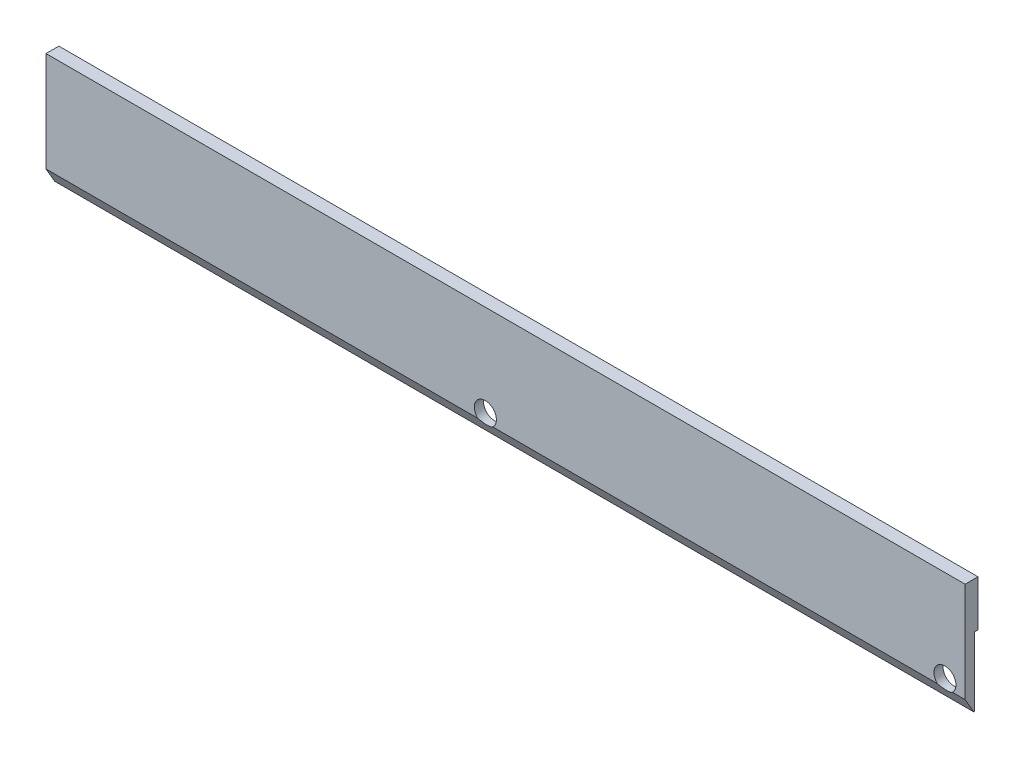
ISO-10303-21;
HEADER;
FILE_DESCRIPTION(('STEP AP214'),'2;1');
FILE_NAME('part.step','',(''),(''),'','','');
FILE_SCHEMA(('AUTOMOTIVE_DESIGN { 1 0 10303 214 1 1 1 1 }'));
ENDSEC;
DATA;
#1=APPLICATION_CONTEXT('core data for automotive mechanical design processes');
#2=APPLICATION_PROTOCOL_DEFINITION('international standard','automotive_design',2000,#1);
#3=PRODUCT_CONTEXT('',#1,'mechanical');
#4=PRODUCT('Part','Part','',(#3));
#5=PRODUCT_RELATED_PRODUCT_CATEGORY('part','',(#4));
#6=PRODUCT_DEFINITION_FORMATION('','',#4);
#7=PRODUCT_DEFINITION_CONTEXT('part definition',#1,'design');
#8=PRODUCT_DEFINITION('design','',#6,#7);
#9=PRODUCT_DEFINITION_SHAPE('','',#8);
#10=(LENGTH_UNIT() NAMED_UNIT(*) SI_UNIT(.MILLI.,.METRE.));
#11=(NAMED_UNIT(*) PLANE_ANGLE_UNIT() SI_UNIT($,.RADIAN.));
#12=(NAMED_UNIT(*) SI_UNIT($,.STERADIAN.) SOLID_ANGLE_UNIT());
#13=UNCERTAINTY_MEASURE_WITH_UNIT(LENGTH_MEASURE(1.E-05),#10,'distance_accuracy_value','');
#14=(GEOMETRIC_REPRESENTATION_CONTEXT(3) GLOBAL_UNCERTAINTY_ASSIGNED_CONTEXT((#13)) GLOBAL_UNIT_ASSIGNED_CONTEXT((#10,
#11,#12)) REPRESENTATION_CONTEXT('',''));
#15=CARTESIAN_POINT('',(0.,0.,0.));
#16=DIRECTION('',(0.,0.,1.));
#17=DIRECTION('',(1.,0.,0.));
#18=AXIS2_PLACEMENT_3D('',#15,#16,#17);
#19=CARTESIAN_POINT('',(0.,0.,0.));
#20=DIRECTION('',(0.,0.,1.));
#21=DIRECTION('',(1.,0.,0.));
#22=AXIS2_PLACEMENT_3D('',#19,#20,#21);
#23=PLANE('',#22);
#24=CARTESIAN_POINT('',(248.412,12.7,0.));
#25=DIRECTION('',(0.,0.,1.));
#26=DIRECTION('',(1.,0.,0.));
#27=AXIS2_PLACEMENT_3D('',#24,#25,#26);
#28=CIRCLE('',#27,3.04800000000001);
#29=CARTESIAN_POINT('',(251.46,12.7,0.));
#30=VERTEX_POINT('',#29);
#31=EDGE_CURVE('E148',#30,#30,#28,.T.);
#32=ORIENTED_EDGE('',*,*,#31,.T.);
#33=EDGE_LOOP('',(#32));
#34=FACE_BOUND('',#33,.T.);
#35=CARTESIAN_POINT('',(121.412,12.7,0.));
#36=DIRECTION('',(0.,0.,1.));
#37=DIRECTION('',(1.,0.,0.));
#38=AXIS2_PLACEMENT_3D('',#35,#36,#37);
#39=CIRCLE('',#38,3.048);
#40=CARTESIAN_POINT('',(124.46,12.7,0.));
#41=VERTEX_POINT('',#40);
#42=EDGE_CURVE('E167',#41,#41,#39,.T.);
#43=ORIENTED_EDGE('',*,*,#42,.T.);
#44=EDGE_LOOP('',(#43));
#45=FACE_BOUND('',#44,.T.);
#46=DIRECTION('',(-0.488603368931844,-0.87250601594972,0.));
#47=VECTOR('',#46,1.);
#48=CARTESIAN_POINT('',(3.556,6.35,0.));
#49=LINE('',#48,#47);
#50=CARTESIAN_POINT('',(14.224,25.4,0.));
#51=VERTEX_POINT('',#50);
#52=CARTESIAN_POINT('',(3.556,6.35,0.));
#53=VERTEX_POINT('',#52);
#54=EDGE_CURVE('E124',#51,#53,#49,.T.);
#55=ORIENTED_EDGE('',*,*,#54,.F.);
#56=DIRECTION('',(-1.,0.,0.));
#57=VECTOR('',#56,1.);
#58=CARTESIAN_POINT('',(254.,25.4,0.));
#59=LINE('',#58,#57);
#60=CARTESIAN_POINT('',(254.,25.4,0.));
#61=VERTEX_POINT('',#60);
#62=EDGE_CURVE('E51',#61,#51,#59,.T.);
#63=ORIENTED_EDGE('',*,*,#62,.F.);
#64=DIRECTION('',(0.,-1.,0.));
#65=VECTOR('',#64,1.);
#66=CARTESIAN_POINT('',(254.,0.,0.));
#67=LINE('',#66,#65);
#68=CARTESIAN_POINT('',(254.,6.35,0.));
#69=VERTEX_POINT('',#68);
#70=EDGE_CURVE('E170',#61,#69,#67,.T.);
#71=ORIENTED_EDGE('',*,*,#70,.T.);
#72=DIRECTION('',(1.,0.,0.));
#73=VECTOR('',#72,1.);
#74=CARTESIAN_POINT('',(0.,6.35,0.));
#75=LINE('',#74,#73);
#76=EDGE_CURVE('E153',#53,#69,#75,.T.);
#77=ORIENTED_EDGE('',*,*,#76,.F.);
#78=EDGE_LOOP('',(#55,#63,#71,#77));
#79=FACE_BOUND('',#78,.T.);
#80=ADVANCED_FACE('F36',(#34,#45,#79),#23,.F.);
#81=CARTESIAN_POINT('',(254.,25.4,-1.016));
#82=DIRECTION('',(0.,1.,0.));
#83=DIRECTION('',(-1.,0.,0.));
#84=AXIS2_PLACEMENT_3D('',#81,#82,#83);
#85=PLANE('',#84);
#86=DIRECTION('',(0.,0.,1.));
#87=VECTOR('',#86,1.);
#88=CARTESIAN_POINT('',(14.224,25.4,-1.016));
#89=LINE('',#88,#87);
#90=CARTESIAN_POINT('',(14.224,25.4,-1.016));
#91=VERTEX_POINT('',#90);
#92=EDGE_CURVE('E116',#91,#51,#89,.T.);
#93=ORIENTED_EDGE('',*,*,#92,.F.);
#94=DIRECTION('',(-1.,0.,0.));
#95=VECTOR('',#94,1.);
#96=CARTESIAN_POINT('',(254.,25.4,-1.016));
#97=LINE('',#96,#95);
#98=CARTESIAN_POINT('',(254.,25.4,-1.016));
#99=VERTEX_POINT('',#98);
#100=EDGE_CURVE('E129',#99,#91,#97,.T.);
#101=ORIENTED_EDGE('',*,*,#100,.F.);
#102=DIRECTION('',(0.,0.,1.));
#103=VECTOR('',#102,1.);
#104=CARTESIAN_POINT('',(254.,25.4,-1.016));
#105=LINE('',#104,#103);
#106=EDGE_CURVE('E145',#99,#61,#105,.T.);
#107=ORIENTED_EDGE('',*,*,#106,.T.);
#108=ORIENTED_EDGE('',*,*,#62,.T.);
#109=EDGE_LOOP('',(#93,#101,#107,#108));
#110=FACE_BOUND('',#109,.T.);
#111=ADVANCED_FACE('F127',(#110),#85,.F.);
#112=CARTESIAN_POINT('',(254.,0.,2.54));
#113=DIRECTION('',(1.,0.,0.));
#114=DIRECTION('',(0.,0.,-1.));
#115=AXIS2_PLACEMENT_3D('',#112,#113,#114);
#116=PLANE('',#115);
#117=DIRECTION('',(0.,-1.,0.));
#118=VECTOR('',#117,1.);
#119=CARTESIAN_POINT('',(254.,0.,2.54));
#120=LINE('',#119,#118);
#121=CARTESIAN_POINT('',(254.,38.1,2.54));
#122=VERTEX_POINT('',#121);
#123=CARTESIAN_POINT('',(254.,10.4722809220139,2.54));
#124=VERTEX_POINT('',#123);
#125=EDGE_CURVE('E156',#122,#124,#120,.T.);
#126=ORIENTED_EDGE('',*,*,#125,.T.);
#127=DIRECTION('',(0.,-0.866025403784436,-0.500000000000005));
#128=VECTOR('',#127,1.);
#129=CARTESIAN_POINT('',(254.,2.61807023050352,-1.99463065701559));
#130=LINE('',#129,#128);
#131=CARTESIAN_POINT('',(254.,6.35,0.160000000000007));
#132=VERTEX_POINT('',#131);
#133=EDGE_CURVE('E192',#124,#132,#130,.T.);
#134=ORIENTED_EDGE('',*,*,#133,.T.);
#135=DIRECTION('',(0.,0.,-1.));
#136=VECTOR('',#135,1.);
#137=CARTESIAN_POINT('',(254.,6.35,2.54));
#138=LINE('',#137,#136);
#139=EDGE_CURVE('E164',#132,#69,#138,.T.);
#140=ORIENTED_EDGE('',*,*,#139,.T.);
#141=ORIENTED_EDGE('',*,*,#70,.F.);
#142=ORIENTED_EDGE('',*,*,#106,.F.);
#143=DIRECTION('',(0.,-1.,0.));
#144=VECTOR('',#143,1.);
#145=CARTESIAN_POINT('',(254.,38.1,-1.016));
#146=LINE('',#145,#144);
#147=CARTESIAN_POINT('',(254.,38.1,-1.016));
#148=VERTEX_POINT('',#147);
#149=EDGE_CURVE('E135',#148,#99,#146,.T.);
#150=ORIENTED_EDGE('',*,*,#149,.F.);
#151=DIRECTION('',(0.,0.,-1.));
#152=VECTOR('',#151,1.);
#153=CARTESIAN_POINT('',(254.,38.1,2.54));
#154=LINE('',#153,#152);
#155=EDGE_CURVE('E179',#122,#148,#154,.T.);
#156=ORIENTED_EDGE('',*,*,#155,.F.);
#157=EDGE_LOOP('',(#126,#134,#140,#141,#142,#150,#156));
#158=FACE_BOUND('',#157,.T.);
#159=ADVANCED_FACE('F195',(#158),#116,.T.);
#160=CARTESIAN_POINT('',(0.,38.1,2.54));
#161=DIRECTION('',(0.,1.,0.));
#162=DIRECTION('',(0.,0.,1.));
#163=AXIS2_PLACEMENT_3D('',#160,#161,#162);
#164=PLANE('',#163);
#165=ORIENTED_EDGE('',*,*,#155,.T.);
#166=DIRECTION('',(1.,0.,0.));
#167=VECTOR('',#166,1.);
#168=CARTESIAN_POINT('',(254.,38.1,-1.016));
#169=LINE('',#168,#167);
#170=CARTESIAN_POINT('',(0.,38.1,-1.016));
#171=VERTEX_POINT('',#170);
#172=EDGE_CURVE('E140',#171,#148,#169,.T.);
#173=ORIENTED_EDGE('',*,*,#172,.F.);
#174=DIRECTION('',(0.,0.,-1.));
#175=VECTOR('',#174,1.);
#176=CARTESIAN_POINT('',(0.,38.1,2.54));
#177=LINE('',#176,#175);
#178=CARTESIAN_POINT('',(0.,38.1,2.54));
#179=VERTEX_POINT('',#178);
#180=EDGE_CURVE('E177',#179,#171,#177,.T.);
#181=ORIENTED_EDGE('',*,*,#180,.F.);
#182=DIRECTION('',(1.,0.,0.));
#183=VECTOR('',#182,1.);
#184=CARTESIAN_POINT('',(0.,38.1,2.54));
#185=LINE('',#184,#183);
#186=EDGE_CURVE('E159',#179,#122,#185,.T.);
#187=ORIENTED_EDGE('',*,*,#186,.T.);
#188=EDGE_LOOP('',(#165,#173,#181,#187));
#189=FACE_BOUND('',#188,.T.);
#190=ADVANCED_FACE('F213',(#189),#164,.T.);
#191=CARTESIAN_POINT('',(0.,0.,2.54));
#192=DIRECTION('',(-1.,0.,0.));
#193=DIRECTION('',(0.,0.,1.));
#194=AXIS2_PLACEMENT_3D('',#191,#192,#193);
#195=PLANE('',#194);
#196=DIRECTION('',(0.,0.,-1.));
#197=VECTOR('',#196,1.);
#198=CARTESIAN_POINT('',(0.,6.35,2.54));
#199=LINE('',#198,#197);
#200=CARTESIAN_POINT('',(0.,6.35,0.160000000000007));
#201=VERTEX_POINT('',#200);
#202=CARTESIAN_POINT('',(0.,6.35,-1.016));
#203=VERTEX_POINT('',#202);
#204=EDGE_CURVE('E175',#201,#203,#199,.T.);
#205=ORIENTED_EDGE('',*,*,#204,.F.);
#206=DIRECTION('',(0.,0.866025403784436,0.500000000000005));
#207=VECTOR('',#206,1.);
#208=CARTESIAN_POINT('',(0.,2.61807023050352,-1.99463065701559));
#209=LINE('',#208,#207);
#210=CARTESIAN_POINT('',(0.,10.4722809220139,2.54));
#211=VERTEX_POINT('',#210);
#212=EDGE_CURVE('E11',#201,#211,#209,.T.);
#213=ORIENTED_EDGE('',*,*,#212,.T.);
#214=DIRECTION('',(0.,1.,0.));
#215=VECTOR('',#214,1.);
#216=CARTESIAN_POINT('',(0.,0.,2.54));
#217=LINE('',#216,#215);
#218=EDGE_CURVE('E162',#211,#179,#217,.T.);
#219=ORIENTED_EDGE('',*,*,#218,.T.);
#220=ORIENTED_EDGE('',*,*,#180,.T.);
#221=DIRECTION('',(0.,1.,0.));
#222=VECTOR('',#221,1.);
#223=CARTESIAN_POINT('',(0.,38.1,-1.016));
#224=LINE('',#223,#222);
#225=EDGE_CURVE('E137',#203,#171,#224,.T.);
#226=ORIENTED_EDGE('',*,*,#225,.F.);
#227=EDGE_LOOP('',(#205,#213,#219,#220,#226));
#228=FACE_BOUND('',#227,.T.);
#229=ADVANCED_FACE('F205',(#228),#195,.T.);
#230=CARTESIAN_POINT('',(121.412,12.7,2.54));
#231=DIRECTION('',(0.,0.,-1.));
#232=DIRECTION('',(-1.,0.,0.));
#233=AXIS2_PLACEMENT_3D('',#230,#231,#232);
#234=CYLINDRICAL_SURFACE('',#233,3.048);
#235=CARTESIAN_POINT('',(121.412,12.7,2.54));
#236=DIRECTION('',(0.,0.,1.));
#237=DIRECTION('',(1.,0.,0.));
#238=AXIS2_PLACEMENT_3D('',#235,#236,#237);
#239=CIRCLE('',#238,3.048);
#240=CARTESIAN_POINT('',(123.492281641888,10.4722809220139,2.54));
#241=VERTEX_POINT('',#240);
#242=CARTESIAN_POINT('',(119.331718358112,10.4722809220139,2.54));
#243=VERTEX_POINT('',#242);
#244=EDGE_CURVE('E152',#241,#243,#239,.T.);
#245=ORIENTED_EDGE('',*,*,#244,.T.);
#246=CARTESIAN_POINT('',(121.412,12.7,3.82617420935418));
#247=DIRECTION('',(0.,-0.500000000000005,0.866025403784436));
#248=DIRECTION('',(0.,-0.866025403784436,-0.500000000000005));
#249=AXIS2_PLACEMENT_3D('',#246,#247,#248);
#250=ELLIPSE('',#249,3.51952724097997,3.048);
#251=EDGE_CURVE('E188',#243,#241,#250,.T.);
#252=ORIENTED_EDGE('',*,*,#251,.T.);
#253=EDGE_LOOP('',(#245,#252));
#254=FACE_BOUND('',#253,.T.);
#255=ORIENTED_EDGE('',*,*,#42,.F.);
#256=EDGE_LOOP('',(#255));
#257=FACE_BOUND('',#256,.T.);
#258=ADVANCED_FACE('F233',(#254,#257),#234,.F.);
#259=CARTESIAN_POINT('',(248.412,12.7,2.54));
#260=DIRECTION('',(0.,0.,-1.));
#261=DIRECTION('',(-1.,0.,0.));
#262=AXIS2_PLACEMENT_3D('',#259,#260,#261);
#263=CYLINDRICAL_SURFACE('',#262,3.04800000000001);
#264=CARTESIAN_POINT('',(248.412,12.7,2.54));
#265=DIRECTION('',(0.,0.,1.));
#266=DIRECTION('',(1.,0.,0.));
#267=AXIS2_PLACEMENT_3D('',#264,#265,#266);
#268=CIRCLE('',#267,3.04800000000001);
#269=CARTESIAN_POINT('',(250.492281641888,10.4722809220139,2.54));
#270=VERTEX_POINT('',#269);
#271=CARTESIAN_POINT('',(246.331718358112,10.4722809220139,2.54));
#272=VERTEX_POINT('',#271);
#273=EDGE_CURVE('E149',#270,#272,#268,.T.);
#274=ORIENTED_EDGE('',*,*,#273,.T.);
#275=CARTESIAN_POINT('',(248.412,12.7,3.82617420935418));
#276=DIRECTION('',(0.,-0.500000000000005,0.866025403784436));
#277=DIRECTION('',(0.,-0.866025403784436,-0.500000000000005));
#278=AXIS2_PLACEMENT_3D('',#275,#276,#277);
#279=ELLIPSE('',#278,3.51952724097998,3.04800000000001);
#280=EDGE_CURVE('E190',#272,#270,#279,.T.);
#281=ORIENTED_EDGE('',*,*,#280,.T.);
#282=EDGE_LOOP('',(#274,#281));
#283=FACE_BOUND('',#282,.T.);
#284=ORIENTED_EDGE('',*,*,#31,.F.);
#285=EDGE_LOOP('',(#284));
#286=FACE_BOUND('',#285,.T.);
#287=ADVANCED_FACE('F230',(#283,#286),#263,.F.);
#288=CARTESIAN_POINT('',(0.,6.35,2.54));
#289=DIRECTION('',(0.,1.,0.));
#290=DIRECTION('',(0.,0.,1.));
#291=AXIS2_PLACEMENT_3D('',#288,#289,#290);
#292=PLANE('',#291);
#293=ORIENTED_EDGE('',*,*,#139,.F.);
#294=DIRECTION('',(-1.,0.,0.));
#295=VECTOR('',#294,1.);
#296=CARTESIAN_POINT('',(0.,6.35,0.160000000000007));
#297=LINE('',#296,#295);
#298=EDGE_CURVE('E44',#132,#201,#297,.T.);
#299=ORIENTED_EDGE('',*,*,#298,.T.);
#300=ORIENTED_EDGE('',*,*,#204,.T.);
#301=DIRECTION('',(-1.,0.,0.));
#302=VECTOR('',#301,1.);
#303=CARTESIAN_POINT('',(0.,6.35,-1.016));
#304=LINE('',#303,#302);
#305=CARTESIAN_POINT('',(3.556,6.35,-1.016));
#306=VERTEX_POINT('',#305);
#307=EDGE_CURVE('E123',#306,#203,#304,.T.);
#308=ORIENTED_EDGE('',*,*,#307,.F.);
#309=DIRECTION('',(0.,0.,1.));
#310=VECTOR('',#309,1.);
#311=CARTESIAN_POINT('',(3.556,6.35,-1.016));
#312=LINE('',#311,#310);
#313=EDGE_CURVE('E118',#306,#53,#312,.T.);
#314=ORIENTED_EDGE('',*,*,#313,.T.);
#315=ORIENTED_EDGE('',*,*,#76,.T.);
#316=EDGE_LOOP('',(#293,#299,#300,#308,#314,#315));
#317=FACE_BOUND('',#316,.T.);
#318=ADVANCED_FACE('F199',(#317),#292,.F.);
#319=CARTESIAN_POINT('',(0.,0.,2.54));
#320=DIRECTION('',(0.,0.,1.));
#321=DIRECTION('',(1.,0.,0.));
#322=AXIS2_PLACEMENT_3D('',#319,#320,#321);
#323=PLANE('',#322);
#324=ORIENTED_EDGE('',*,*,#218,.F.);
#325=DIRECTION('',(1.,0.,0.));
#326=VECTOR('',#325,1.);
#327=CARTESIAN_POINT('',(254.,10.4722809220139,2.54));
#328=LINE('',#327,#326);
#329=EDGE_CURVE('E185',#211,#243,#328,.T.);
#330=ORIENTED_EDGE('',*,*,#329,.T.);
#331=ORIENTED_EDGE('',*,*,#244,.F.);
#332=DIRECTION('',(1.,0.,0.));
#333=VECTOR('',#332,1.);
#334=CARTESIAN_POINT('',(254.,10.4722809220139,2.54));
#335=LINE('',#334,#333);
#336=EDGE_CURVE('E183',#241,#272,#335,.T.);
#337=ORIENTED_EDGE('',*,*,#336,.T.);
#338=ORIENTED_EDGE('',*,*,#273,.F.);
#339=DIRECTION('',(1.,0.,0.));
#340=VECTOR('',#339,1.);
#341=CARTESIAN_POINT('',(254.,10.4722809220139,2.54));
#342=LINE('',#341,#340);
#343=EDGE_CURVE('E181',#270,#124,#342,.T.);
#344=ORIENTED_EDGE('',*,*,#343,.T.);
#345=ORIENTED_EDGE('',*,*,#125,.F.);
#346=ORIENTED_EDGE('',*,*,#186,.F.);
#347=EDGE_LOOP('',(#324,#330,#331,#337,#338,#344,#345,#346));
#348=FACE_BOUND('',#347,.T.);
#349=ADVANCED_FACE('F210',(#348),#323,.T.);
#350=CARTESIAN_POINT('',(0.,10.4722809220139,2.54));
#351=DIRECTION('',(0.,-0.500000000000005,0.866025403784436));
#352=DIRECTION('',(-1.,0.,0.));
#353=AXIS2_PLACEMENT_3D('',#350,#351,#352);
#354=PLANE('',#353);
#355=ORIENTED_EDGE('',*,*,#212,.F.);
#356=ORIENTED_EDGE('',*,*,#298,.F.);
#357=ORIENTED_EDGE('',*,*,#133,.F.);
#358=ORIENTED_EDGE('',*,*,#343,.F.);
#359=ORIENTED_EDGE('',*,*,#280,.F.);
#360=ORIENTED_EDGE('',*,*,#336,.F.);
#361=ORIENTED_EDGE('',*,*,#251,.F.);
#362=ORIENTED_EDGE('',*,*,#329,.F.);
#363=EDGE_LOOP('',(#355,#356,#357,#358,#359,#360,#361,#362));
#364=FACE_BOUND('',#363,.T.);
#365=ADVANCED_FACE('F38',(#364),#354,.T.);
#366=CARTESIAN_POINT('',(0.,0.,-1.016));
#367=DIRECTION('',(0.,0.,-1.));
#368=DIRECTION('',(-1.,0.,0.));
#369=AXIS2_PLACEMENT_3D('',#366,#367,#368);
#370=PLANE('',#369);
#371=ORIENTED_EDGE('',*,*,#149,.T.);
#372=ORIENTED_EDGE('',*,*,#100,.T.);
#373=DIRECTION('',(-0.488603368931844,-0.87250601594972,0.));
#374=VECTOR('',#373,1.);
#375=CARTESIAN_POINT('',(3.556,6.35,-1.016));
#376=LINE('',#375,#374);
#377=EDGE_CURVE('E113',#91,#306,#376,.T.);
#378=ORIENTED_EDGE('',*,*,#377,.T.);
#379=ORIENTED_EDGE('',*,*,#307,.T.);
#380=ORIENTED_EDGE('',*,*,#225,.T.);
#381=ORIENTED_EDGE('',*,*,#172,.T.);
#382=EDGE_LOOP('',(#371,#372,#378,#379,#380,#381));
#383=FACE_BOUND('',#382,.T.);
#384=ADVANCED_FACE('F132',(#383),#370,.T.);
#385=CARTESIAN_POINT('',(3.556,6.35,-1.016));
#386=DIRECTION('',(-0.87250601594972,0.488603368931843,0.));
#387=DIRECTION('',(-0.488603368931844,-0.87250601594972,0.));
#388=AXIS2_PLACEMENT_3D('',#385,#386,#387);
#389=PLANE('',#388);
#390=ORIENTED_EDGE('',*,*,#54,.T.);
#391=ORIENTED_EDGE('',*,*,#313,.F.);
#392=ORIENTED_EDGE('',*,*,#377,.F.);
#393=ORIENTED_EDGE('',*,*,#92,.T.);
#394=EDGE_LOOP('',(#390,#391,#392,#393));
#395=FACE_BOUND('',#394,.T.);
#396=ADVANCED_FACE('F115',(#395),#389,.F.);
#397=CLOSED_SHELL('',(#80,#111,#159,#190,#229,#258,#287,#318,#349,#365,#384,#396));
#398=MANIFOLD_SOLID_BREP('B2',#397);
#399=ADVANCED_BREP_SHAPE_REPRESENTATION('',(#18,#398),#14);
#400=SHAPE_DEFINITION_REPRESENTATION(#9,#399);
ENDSEC;
END-ISO-10303-21;
